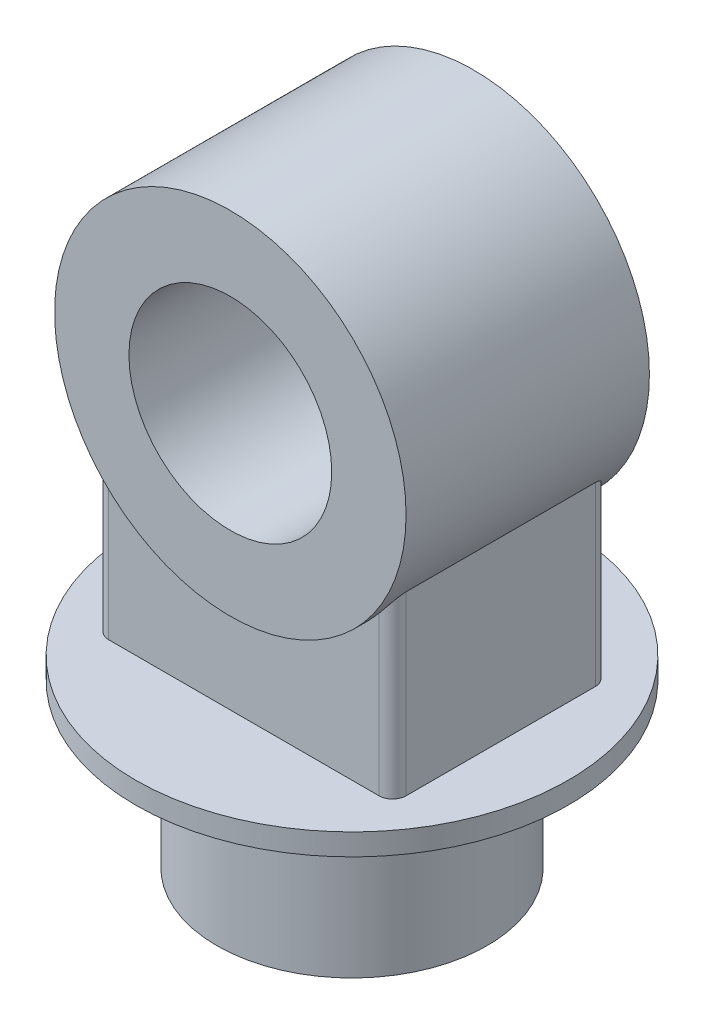
ISO-10303-21;
HEADER;
FILE_DESCRIPTION(('STEP AP214'),'2;1');
FILE_NAME('part.step','',(''),(''),'','','');
FILE_SCHEMA(('AUTOMOTIVE_DESIGN { 1 0 10303 214 1 1 1 1 }'));
ENDSEC;
DATA;
#1=APPLICATION_CONTEXT('core data for automotive mechanical design processes');
#2=APPLICATION_PROTOCOL_DEFINITION('international standard','automotive_design',2000,#1);
#3=PRODUCT_CONTEXT('',#1,'mechanical');
#4=PRODUCT('Part','Part','',(#3));
#5=PRODUCT_RELATED_PRODUCT_CATEGORY('part','',(#4));
#6=PRODUCT_DEFINITION_FORMATION('','',#4);
#7=PRODUCT_DEFINITION_CONTEXT('part definition',#1,'design');
#8=PRODUCT_DEFINITION('design','',#6,#7);
#9=PRODUCT_DEFINITION_SHAPE('','',#8);
#10=(LENGTH_UNIT() NAMED_UNIT(*) SI_UNIT(.MILLI.,.METRE.));
#11=(NAMED_UNIT(*) PLANE_ANGLE_UNIT() SI_UNIT($,.RADIAN.));
#12=(NAMED_UNIT(*) SI_UNIT($,.STERADIAN.) SOLID_ANGLE_UNIT());
#13=UNCERTAINTY_MEASURE_WITH_UNIT(LENGTH_MEASURE(1.E-05),#10,'distance_accuracy_value','');
#14=(GEOMETRIC_REPRESENTATION_CONTEXT(3) GLOBAL_UNCERTAINTY_ASSIGNED_CONTEXT((#13)) GLOBAL_UNIT_ASSIGNED_CONTEXT((#10,
#11,#12)) REPRESENTATION_CONTEXT('',''));
#15=CARTESIAN_POINT('',(0.,0.,0.));
#16=DIRECTION('',(0.,0.,1.));
#17=DIRECTION('',(1.,0.,0.));
#18=AXIS2_PLACEMENT_3D('',#15,#16,#17);
#19=CARTESIAN_POINT('',(0.,120.,0.));
#20=DIRECTION('',(0.,-1.,0.));
#21=DIRECTION('',(0.,0.,-1.));
#22=AXIS2_PLACEMENT_3D('',#19,#20,#21);
#23=CYLINDRICAL_SURFACE('',#22,100.);
#24=CARTESIAN_POINT('',(0.,120.,0.));
#25=DIRECTION('',(0.,1.,0.));
#26=DIRECTION('',(0.,0.,1.));
#27=AXIS2_PLACEMENT_3D('',#24,#25,#26);
#28=CIRCLE('',#27,100.);
#29=CARTESIAN_POINT('',(0.,120.,100.));
#30=VERTEX_POINT('',#29);
#31=EDGE_CURVE('E131',#30,#30,#28,.T.);
#32=ORIENTED_EDGE('',*,*,#31,.F.);
#33=EDGE_LOOP('',(#32));
#34=FACE_BOUND('',#33,.T.);
#35=CARTESIAN_POINT('',(0.,0.,0.));
#36=DIRECTION('',(0.,1.,0.));
#37=DIRECTION('',(0.,0.,1.));
#38=AXIS2_PLACEMENT_3D('',#35,#36,#37);
#39=CIRCLE('',#38,100.);
#40=CARTESIAN_POINT('',(0.,0.,100.));
#41=VERTEX_POINT('',#40);
#42=EDGE_CURVE('E203',#41,#41,#39,.T.);
#43=ORIENTED_EDGE('',*,*,#42,.T.);
#44=EDGE_LOOP('',(#43));
#45=FACE_BOUND('',#44,.T.);
#46=ADVANCED_FACE('F33',(#34,#45),#23,.T.);
#47=CARTESIAN_POINT('',(0.,0.,0.));
#48=DIRECTION('',(0.,1.,0.));
#49=DIRECTION('',(0.,0.,1.));
#50=AXIS2_PLACEMENT_3D('',#47,#48,#49);
#51=PLANE('',#50);
#52=ORIENTED_EDGE('',*,*,#42,.F.);
#53=EDGE_LOOP('',(#52));
#54=FACE_BOUND('',#53,.T.);
#55=ADVANCED_FACE('F213',(#54),#51,.F.);
#56=CARTESIAN_POINT('',(0.,136.,0.));
#57=DIRECTION('',(0.,-1.,0.));
#58=DIRECTION('',(0.,0.,-1.));
#59=AXIS2_PLACEMENT_3D('',#56,#57,#58);
#60=CYLINDRICAL_SURFACE('',#59,160.);
#61=CARTESIAN_POINT('',(0.,136.,0.));
#62=DIRECTION('',(0.,1.,0.));
#63=DIRECTION('',(0.,0.,1.));
#64=AXIS2_PLACEMENT_3D('',#61,#62,#63);
#65=CIRCLE('',#64,160.);
#66=CARTESIAN_POINT('',(0.,136.,160.));
#67=VERTEX_POINT('',#66);
#68=EDGE_CURVE('E200',#67,#67,#65,.T.);
#69=ORIENTED_EDGE('',*,*,#68,.F.);
#70=EDGE_LOOP('',(#69));
#71=FACE_BOUND('',#70,.T.);
#72=CARTESIAN_POINT('',(0.,120.,0.));
#73=DIRECTION('',(0.,1.,0.));
#74=DIRECTION('',(0.,0.,1.));
#75=AXIS2_PLACEMENT_3D('',#72,#73,#74);
#76=CIRCLE('',#75,160.);
#77=CARTESIAN_POINT('',(0.,120.,160.));
#78=VERTEX_POINT('',#77);
#79=EDGE_CURVE('E204',#78,#78,#76,.T.);
#80=ORIENTED_EDGE('',*,*,#79,.T.);
#81=EDGE_LOOP('',(#80));
#82=FACE_BOUND('',#81,.T.);
#83=ADVANCED_FACE('F215',(#71,#82),#60,.T.);
#84=CARTESIAN_POINT('',(0.,136.,0.));
#85=DIRECTION('',(0.,1.,0.));
#86=DIRECTION('',(0.,0.,1.));
#87=AXIS2_PLACEMENT_3D('',#84,#85,#86);
#88=PLANE('',#87);
#89=DIRECTION('',(0.,0.,1.));
#90=VECTOR('',#89,1.);
#91=CARTESIAN_POINT('',(-110.,136.,-80.));
#92=LINE('',#91,#90);
#93=CARTESIAN_POINT('',(-110.,136.,-70.));
#94=VERTEX_POINT('',#93);
#95=CARTESIAN_POINT('',(-110.,136.,70.));
#96=VERTEX_POINT('',#95);
#97=EDGE_CURVE('E188',#94,#96,#92,.T.);
#98=ORIENTED_EDGE('',*,*,#97,.F.);
#99=CARTESIAN_POINT('',(-100.,136.,-70.));
#100=DIRECTION('',(0.,1.,0.));
#101=DIRECTION('',(0.,0.,1.));
#102=AXIS2_PLACEMENT_3D('',#99,#100,#101);
#103=CIRCLE('',#102,10.);
#104=CARTESIAN_POINT('',(-100.,136.,-80.));
#105=VERTEX_POINT('',#104);
#106=EDGE_CURVE('E47',#94,#105,#103,.F.);
#107=ORIENTED_EDGE('',*,*,#106,.T.);
#108=DIRECTION('',(-1.,0.,0.));
#109=VECTOR('',#108,1.);
#110=CARTESIAN_POINT('',(110.,136.,-80.));
#111=LINE('',#110,#109);
#112=CARTESIAN_POINT('',(100.,136.,-80.));
#113=VERTEX_POINT('',#112);
#114=EDGE_CURVE('E187',#113,#105,#111,.T.);
#115=ORIENTED_EDGE('',*,*,#114,.F.);
#116=CARTESIAN_POINT('',(100.,136.,-70.));
#117=DIRECTION('',(0.,1.,0.));
#118=DIRECTION('',(0.,0.,1.));
#119=AXIS2_PLACEMENT_3D('',#116,#117,#118);
#120=CIRCLE('',#119,10.);
#121=CARTESIAN_POINT('',(110.,136.,-70.));
#122=VERTEX_POINT('',#121);
#123=EDGE_CURVE('E174',#113,#122,#120,.F.);
#124=ORIENTED_EDGE('',*,*,#123,.T.);
#125=DIRECTION('',(0.,0.,-1.));
#126=VECTOR('',#125,1.);
#127=CARTESIAN_POINT('',(110.,136.,-80.));
#128=LINE('',#127,#126);
#129=CARTESIAN_POINT('',(110.,136.,70.));
#130=VERTEX_POINT('',#129);
#131=EDGE_CURVE('E193',#130,#122,#128,.T.);
#132=ORIENTED_EDGE('',*,*,#131,.F.);
#133=CARTESIAN_POINT('',(100.,136.,70.));
#134=DIRECTION('',(0.,1.,0.));
#135=DIRECTION('',(0.,0.,1.));
#136=AXIS2_PLACEMENT_3D('',#133,#134,#135);
#137=CIRCLE('',#136,10.);
#138=CARTESIAN_POINT('',(100.,136.,80.));
#139=VERTEX_POINT('',#138);
#140=EDGE_CURVE('E112',#130,#139,#137,.F.);
#141=ORIENTED_EDGE('',*,*,#140,.T.);
#142=DIRECTION('',(1.,0.,0.));
#143=VECTOR('',#142,1.);
#144=CARTESIAN_POINT('',(110.,136.,80.));
#145=LINE('',#144,#143);
#146=CARTESIAN_POINT('',(-100.,136.,80.));
#147=VERTEX_POINT('',#146);
#148=EDGE_CURVE('E266',#147,#139,#145,.T.);
#149=ORIENTED_EDGE('',*,*,#148,.F.);
#150=CARTESIAN_POINT('',(-100.,136.,70.));
#151=DIRECTION('',(0.,1.,0.));
#152=DIRECTION('',(0.,0.,1.));
#153=AXIS2_PLACEMENT_3D('',#150,#151,#152);
#154=CIRCLE('',#153,10.);
#155=EDGE_CURVE('E113',#147,#96,#154,.F.);
#156=ORIENTED_EDGE('',*,*,#155,.T.);
#157=EDGE_LOOP('',(#98,#107,#115,#124,#132,#141,#149,#156));
#158=FACE_BOUND('',#157,.T.);
#159=ORIENTED_EDGE('',*,*,#68,.T.);
#160=EDGE_LOOP('',(#159));
#161=FACE_BOUND('',#160,.T.);
#162=ADVANCED_FACE('F185',(#158,#161),#88,.T.);
#163=CARTESIAN_POINT('',(0.,120.,0.));
#164=DIRECTION('',(0.,1.,0.));
#165=DIRECTION('',(0.,0.,1.));
#166=AXIS2_PLACEMENT_3D('',#163,#164,#165);
#167=PLANE('',#166);
#168=ORIENTED_EDGE('',*,*,#31,.T.);
#169=EDGE_LOOP('',(#168));
#170=FACE_BOUND('',#169,.T.);
#171=ORIENTED_EDGE('',*,*,#79,.F.);
#172=EDGE_LOOP('',(#171));
#173=FACE_BOUND('',#172,.T.);
#174=ADVANCED_FACE('F224',(#170,#173),#167,.F.);
#175=CARTESIAN_POINT('',(110.,466.002,80.));
#176=DIRECTION('',(0.,0.,-1.));
#177=DIRECTION('',(-1.,0.,0.));
#178=AXIS2_PLACEMENT_3D('',#175,#176,#177);
#179=PLANE('',#178);
#180=CARTESIAN_POINT('',(0.,336.,80.));
#181=DIRECTION('',(0.,0.,-1.));
#182=DIRECTION('',(-1.,0.,0.));
#183=AXIS2_PLACEMENT_3D('',#180,#181,#182);
#184=CIRCLE('',#183,130.);
#185=CARTESIAN_POINT('',(-100.,252.933761370819,80.));
#186=VERTEX_POINT('',#185);
#187=CARTESIAN_POINT('',(100.,252.933761370819,80.));
#188=VERTEX_POINT('',#187);
#189=EDGE_CURVE('E105',#186,#188,#184,.F.);
#190=ORIENTED_EDGE('',*,*,#189,.F.);
#191=DIRECTION('',(0.,-1.,0.));
#192=VECTOR('',#191,1.);
#193=CARTESIAN_POINT('',(-100.,466.002,80.));
#194=LINE('',#193,#192);
#195=EDGE_CURVE('E119',#186,#147,#194,.T.);
#196=ORIENTED_EDGE('',*,*,#195,.T.);
#197=ORIENTED_EDGE('',*,*,#148,.T.);
#198=DIRECTION('',(0.,-1.,0.));
#199=VECTOR('',#198,1.);
#200=CARTESIAN_POINT('',(100.,466.002,80.));
#201=LINE('',#200,#199);
#202=EDGE_CURVE('E122',#139,#188,#201,.F.);
#203=ORIENTED_EDGE('',*,*,#202,.T.);
#204=EDGE_LOOP('',(#190,#196,#197,#203));
#205=FACE_BOUND('',#204,.T.);
#206=ADVANCED_FACE('F117',(#205),#179,.F.);
#207=CARTESIAN_POINT('',(-110.,466.002,-80.));
#208=DIRECTION('',(1.,0.,0.));
#209=DIRECTION('',(0.,0.,-1.));
#210=AXIS2_PLACEMENT_3D('',#207,#208,#209);
#211=PLANE('',#210);
#212=DIRECTION('',(0.,0.,-1.));
#213=VECTOR('',#212,1.);
#214=CARTESIAN_POINT('',(-110.,266.717967697245,90.));
#215=LINE('',#214,#213);
#216=CARTESIAN_POINT('',(-110.,266.717967697245,-70.));
#217=VERTEX_POINT('',#216);
#218=CARTESIAN_POINT('',(-110.,266.717967697245,70.));
#219=VERTEX_POINT('',#218);
#220=EDGE_CURVE('E107',#217,#219,#215,.F.);
#221=ORIENTED_EDGE('',*,*,#220,.F.);
#222=DIRECTION('',(0.,-1.,0.));
#223=VECTOR('',#222,1.);
#224=CARTESIAN_POINT('',(-110.,466.002,-70.));
#225=LINE('',#224,#223);
#226=EDGE_CURVE('E172',#217,#94,#225,.T.);
#227=ORIENTED_EDGE('',*,*,#226,.T.);
#228=ORIENTED_EDGE('',*,*,#97,.T.);
#229=DIRECTION('',(0.,-1.,0.));
#230=VECTOR('',#229,1.);
#231=CARTESIAN_POINT('',(-110.,466.002,70.));
#232=LINE('',#231,#230);
#233=EDGE_CURVE('E127',#96,#219,#232,.F.);
#234=ORIENTED_EDGE('',*,*,#233,.T.);
#235=EDGE_LOOP('',(#221,#227,#228,#234));
#236=FACE_BOUND('',#235,.T.);
#237=ADVANCED_FACE('F196',(#236),#211,.F.);
#238=CARTESIAN_POINT('',(110.,466.002,-80.));
#239=DIRECTION('',(-1.,0.,0.));
#240=DIRECTION('',(0.,0.,1.));
#241=AXIS2_PLACEMENT_3D('',#238,#239,#240);
#242=PLANE('',#241);
#243=ORIENTED_EDGE('',*,*,#131,.T.);
#244=DIRECTION('',(0.,-1.,0.));
#245=VECTOR('',#244,1.);
#246=CARTESIAN_POINT('',(110.,466.002,-70.));
#247=LINE('',#246,#245);
#248=CARTESIAN_POINT('',(110.,266.717967697245,-70.));
#249=VERTEX_POINT('',#248);
#250=EDGE_CURVE('E170',#122,#249,#247,.F.);
#251=ORIENTED_EDGE('',*,*,#250,.T.);
#252=DIRECTION('',(0.,0.,-1.));
#253=VECTOR('',#252,1.);
#254=CARTESIAN_POINT('',(110.,266.717967697245,90.));
#255=LINE('',#254,#253);
#256=CARTESIAN_POINT('',(110.,266.717967697245,70.));
#257=VERTEX_POINT('',#256);
#258=EDGE_CURVE('E123',#257,#249,#255,.T.);
#259=ORIENTED_EDGE('',*,*,#258,.F.);
#260=DIRECTION('',(0.,-1.,0.));
#261=VECTOR('',#260,1.);
#262=CARTESIAN_POINT('',(110.,466.002,70.));
#263=LINE('',#262,#261);
#264=EDGE_CURVE('E129',#257,#130,#263,.T.);
#265=ORIENTED_EDGE('',*,*,#264,.T.);
#266=EDGE_LOOP('',(#243,#251,#259,#265));
#267=FACE_BOUND('',#266,.T.);
#268=ADVANCED_FACE('F232',(#267),#242,.F.);
#269=CARTESIAN_POINT('',(110.,466.002,-80.));
#270=DIRECTION('',(0.,0.,1.));
#271=DIRECTION('',(1.,0.,0.));
#272=AXIS2_PLACEMENT_3D('',#269,#270,#271);
#273=PLANE('',#272);
#274=CARTESIAN_POINT('',(0.,336.,-80.));
#275=DIRECTION('',(0.,0.,1.));
#276=DIRECTION('',(1.,0.,0.));
#277=AXIS2_PLACEMENT_3D('',#274,#275,#276);
#278=CIRCLE('',#277,130.);
#279=CARTESIAN_POINT('',(100.,252.933761370819,-80.0000000000001));
#280=VERTEX_POINT('',#279);
#281=CARTESIAN_POINT('',(-100.,252.933761370819,-80.));
#282=VERTEX_POINT('',#281);
#283=EDGE_CURVE('E207',#280,#282,#278,.F.);
#284=ORIENTED_EDGE('',*,*,#283,.F.);
#285=DIRECTION('',(0.,-1.,0.));
#286=VECTOR('',#285,1.);
#287=CARTESIAN_POINT('',(100.,466.002,-80.));
#288=LINE('',#287,#286);
#289=EDGE_CURVE('E167',#280,#113,#288,.T.);
#290=ORIENTED_EDGE('',*,*,#289,.T.);
#291=ORIENTED_EDGE('',*,*,#114,.T.);
#292=DIRECTION('',(0.,-1.,0.));
#293=VECTOR('',#292,1.);
#294=CARTESIAN_POINT('',(-100.,466.002,-80.));
#295=LINE('',#294,#293);
#296=EDGE_CURVE('E165',#105,#282,#295,.F.);
#297=ORIENTED_EDGE('',*,*,#296,.T.);
#298=EDGE_LOOP('',(#284,#290,#291,#297));
#299=FACE_BOUND('',#298,.T.);
#300=ADVANCED_FACE('F191',(#299),#273,.F.);
#301=CARTESIAN_POINT('',(0.,336.,90.));
#302=DIRECTION('',(0.,0.,-1.));
#303=DIRECTION('',(-1.,0.,0.));
#304=AXIS2_PLACEMENT_3D('',#301,#302,#303);
#305=CYLINDRICAL_SURFACE('',#304,130.);
#306=CARTESIAN_POINT('',(0.,336.,90.));
#307=DIRECTION('',(0.,0.,1.));
#308=DIRECTION('',(1.,0.,0.));
#309=AXIS2_PLACEMENT_3D('',#306,#307,#308);
#310=CIRCLE('',#309,130.);
#311=CARTESIAN_POINT('',(130.,336.,90.));
#312=VERTEX_POINT('',#311);
#313=EDGE_CURVE('E252',#312,#312,#310,.T.);
#314=ORIENTED_EDGE('',*,*,#313,.F.);
#315=EDGE_LOOP('',(#314));
#316=FACE_BOUND('',#315,.T.);
#317=CARTESIAN_POINT('',(0.,336.,-90.));
#318=DIRECTION('',(0.,0.,1.));
#319=DIRECTION('',(1.,0.,0.));
#320=AXIS2_PLACEMENT_3D('',#317,#318,#319);
#321=CIRCLE('',#320,130.);
#322=CARTESIAN_POINT('',(130.,336.,-90.));
#323=VERTEX_POINT('',#322);
#324=EDGE_CURVE('E255',#323,#323,#321,.T.);
#325=ORIENTED_EDGE('',*,*,#324,.T.);
#326=EDGE_LOOP('',(#325));
#327=FACE_BOUND('',#326,.T.);
#328=ORIENTED_EDGE('',*,*,#283,.T.);
#329=CARTESIAN_POINT('',(-100.,252.933761370819,-80.));
#330=CARTESIAN_POINT('',(-100.223611151915,253.202952503255,-79.9999830665315));
#331=CARTESIAN_POINT('',(-100.446118360057,253.473036166024,-79.9924995885085));
#332=CARTESIAN_POINT('',(-100.888548742496,254.014496760122,-79.9629173131463));
#333=CARTESIAN_POINT('',(-101.108472043759,254.285873626978,-79.9408192370116));
#334=CARTESIAN_POINT('',(-101.545586290072,254.829711400373,-79.8822979337703));
#335=CARTESIAN_POINT('',(-101.76277446753,255.102173087004,-79.8458612385231));
#336=CARTESIAN_POINT('',(-102.193849033468,255.647413797012,-79.7588609087488));
#337=CARTESIAN_POINT('',(-102.407735374993,255.920192824843,-79.7082970735217));
#338=CARTESIAN_POINT('',(-103.048408055095,256.74400885936,-79.5343891784366));
#339=CARTESIAN_POINT('',(-103.469748368072,257.294974230618,-79.3894263280958));
#340=CARTESIAN_POINT('',(-104.088382224678,258.117224843771,-79.1288060997197));
#341=CARTESIAN_POINT('',(-104.292337034927,258.39057162742,-79.0347525474724));
#342=CARTESIAN_POINT('',(-104.695498702643,258.935304765081,-78.8319429710982));
#343=CARTESIAN_POINT('',(-104.894706004332,259.206691300842,-78.7231883289499));
#344=CARTESIAN_POINT('',(-105.336170271764,259.812965668139,-78.4620472638272));
#345=CARTESIAN_POINT('',(-105.577006541077,260.147108038148,-78.3055009036513));
#346=CARTESIAN_POINT('',(-106.04966094987,260.809343252621,-77.967808626391));
#347=CARTESIAN_POINT('',(-106.281479043935,261.137436066616,-77.7866625854444));
#348=CARTESIAN_POINT('',(-106.734152264033,261.784259610706,-77.3986376161628));
#349=CARTESIAN_POINT('',(-106.955036134368,262.103013877599,-77.1918317878758));
#350=CARTESIAN_POINT('',(-107.384708325122,262.728803605627,-76.749894392022));
#351=CARTESIAN_POINT('',(-107.593501627276,263.035843875289,-76.5147746155492));
#352=CARTESIAN_POINT('',(-107.921279015409,263.522080966666,-76.1068757916446));
#353=CARTESIAN_POINT('',(-108.044709884718,263.706240813682,-75.9435605188263));
#354=CARTESIAN_POINT('',(-108.284949666933,264.066582834907,-75.6038296157538));
#355=CARTESIAN_POINT('',(-108.401760304956,264.242767084986,-75.4274174262629));
#356=CARTESIAN_POINT('',(-108.627683741988,264.585236991633,-75.0605773993747));
#357=CARTESIAN_POINT('',(-108.736797961361,264.751524473746,-74.8701521613913));
#358=CARTESIAN_POINT('',(-108.945874410432,265.071634412635,-74.4745306992528));
#359=CARTESIAN_POINT('',(-109.04583974995,265.225461102935,-74.2693395369045));
#360=CARTESIAN_POINT('',(-109.274660386151,265.579056080623,-73.7536743100228));
#361=CARTESIAN_POINT('',(-109.398046362816,265.771031349643,-73.4351396850743));
#362=CARTESIAN_POINT('',(-109.561336457207,266.026263049992,-72.9345418523036));
#363=CARTESIAN_POINT('',(-109.612072269395,266.105785634321,-72.7641622498837));
#364=CARTESIAN_POINT('',(-109.705421847597,266.25239837099,-72.4160328323223));
#365=CARTESIAN_POINT('',(-109.748040656091,266.319496241142,-72.2382876769633));
#366=CARTESIAN_POINT('',(-109.820262744001,266.433384610412,-71.8947331689277));
#367=CARTESIAN_POINT('',(-109.850752312767,266.481551609067,-71.7295676109391));
#368=CARTESIAN_POINT('',(-109.903691363628,266.565274678988,-71.3948451418077));
#369=CARTESIAN_POINT('',(-109.926143541964,266.600834979285,-71.2252897238034));
#370=CARTESIAN_POINT('',(-109.962659042777,266.658707696818,-70.8807814271978));
#371=CARTESIAN_POINT('',(-109.976613864032,266.680848750137,-70.7057875562757));
#372=CARTESIAN_POINT('',(-109.99061964662,266.703076138542,-70.4419386674803));
#373=CARTESIAN_POINT('',(-109.99413386492,266.708654625171,-70.3536902139711));
#374=CARTESIAN_POINT('',(-109.998824989492,266.716102079046,-70.1769662160102));
#375=CARTESIAN_POINT('',(-110.000001659485,266.717970671296,-70.088490649507));
#376=CARTESIAN_POINT('',(-110.,266.717967697245,-70.));
#377=B_SPLINE_CURVE_WITH_KNOTS('',3,(#329,#330,#331,#332,#333,#334,#335,#336,#337,#338,#339,
#340,#341,#342,#343,#344,#345,#346,#347,#348,#349,#350,#351,#352,#353,#354,#355,#356,#357,#358,
#359,#360,#361,#362,#363,#364,#365,#366,#367,#368,#369,#370,#371,#372,#373,#374,#375,#376),
.UNSPECIFIED.,.F.,.F.,(4,2,2,2,2,2,2,2,2,2,2,2,2,2,2,2,2,2,2,2,2,2,2,4),(0.,1.04974156507777,
2.09943133114568,3.1501094241726,4.20080244462026,6.32356278933854,7.38465211465329,
8.44564176134495,9.7667768553939,11.0879186017609,12.4053795382948,13.7222937149076,
14.5479419827463,15.3733741023697,16.1986534888326,17.0236513022889,18.1946866504919,
18.7783719827905,19.3616935243414,19.8852298594992,20.408590403038,20.9385006934629,
21.2038887699912,21.4693036704869),.UNSPECIFIED.);
#378=EDGE_CURVE('E11',#282,#217,#377,.T.);
#379=ORIENTED_EDGE('',*,*,#378,.T.);
#380=ORIENTED_EDGE('',*,*,#220,.T.);
#381=CARTESIAN_POINT('',(-110.,266.717967697245,70.));
#382=CARTESIAN_POINT('',(-110.000033683462,266.718025852698,70.1614230595313));
#383=CARTESIAN_POINT('',(-109.996092792414,266.711764254296,70.3228118197691));
#384=CARTESIAN_POINT('',(-109.980519982779,266.687045880384,70.6441123999957));
#385=CARTESIAN_POINT('',(-109.968896213713,266.668602027069,70.8040256031146));
#386=CARTESIAN_POINT('',(-109.938376398954,266.620217986395,71.1196424551221));
#387=CARTESIAN_POINT('',(-109.919558261622,266.590400967593,71.2753727040436));
#388=CARTESIAN_POINT('',(-109.875071558334,266.52000006118,71.5834085562726));
#389=CARTESIAN_POINT('',(-109.849400846184,266.479412800404,71.7357130704249));
#390=CARTESIAN_POINT('',(-109.784772267017,266.377386983169,72.0722520040974));
#391=CARTESIAN_POINT('',(-109.744103525393,266.313281105856,72.2553511890568));
#392=CARTESIAN_POINT('',(-109.654040532803,266.17165023193,72.6141464391851));
#393=CARTESIAN_POINT('',(-109.604640075501,266.094115691273,72.7898371277865));
#394=CARTESIAN_POINT('',(-109.497968805892,265.927147418338,73.133872391345));
#395=CARTESIAN_POINT('',(-109.440667457039,265.837667562915,73.302184951541));
#396=CARTESIAN_POINT('',(-109.319341126161,265.648779195145,73.6304969218558));
#397=CARTESIAN_POINT('',(-109.25531768694,265.549372961282,73.7904982269664));
#398=CARTESIAN_POINT('',(-109.085069343255,265.28590129292,74.1868876463209));
#399=CARTESIAN_POINT('',(-108.974781990569,265.115997241409,74.4176642111939));
#400=CARTESIAN_POINT('',(-108.742772943656,264.76058359918,74.8607110351426));
#401=CARTESIAN_POINT('',(-108.621044869784,264.575065307649,75.072970840064));
#402=CARTESIAN_POINT('',(-108.36794946479,264.19164129378,75.4804206329535));
#403=CARTESIAN_POINT('',(-108.236568322626,263.993717884812,75.6755852518652));
#404=CARTESIAN_POINT('',(-107.965814499919,263.588382733387,76.0497203250662));
#405=CARTESIAN_POINT('',(-107.826442440892,263.380971729107,76.2286920360201));
#406=CARTESIAN_POINT('',(-107.56145650763,262.989174407744,76.5468161797372));
#407=CARTESIAN_POINT('',(-107.436764821801,262.805791987749,76.6879854690674));
#408=CARTESIAN_POINT('',(-107.182869679799,262.434497987953,76.9599552926783));
#409=CARTESIAN_POINT('',(-107.053665586411,262.24658576965,77.0907543539386));
#410=CARTESIAN_POINT('',(-106.659844344167,261.677121003612,77.4685356621902));
#411=CARTESIAN_POINT('',(-106.389102445143,261.289965080353,77.7008024816961));
#412=CARTESIAN_POINT('',(-105.833418194947,260.504836154638,78.129863631631));
#413=CARTESIAN_POINT('',(-105.548442441802,260.106838810795,78.3265689888296));
#414=CARTESIAN_POINT('',(-104.96676628824,259.304344779382,78.6860846955171));
#415=CARTESIAN_POINT('',(-104.670068038633,258.899849292081,78.8489012287858));
#416=CARTESIAN_POINT('',(-104.024574509401,258.030646711215,79.1623550419402));
#417=CARTESIAN_POINT('',(-103.674248758637,257.565348460988,79.3081944572228));
#418=CARTESIAN_POINT('',(-102.961876677953,256.632523338709,79.558756520093));
#419=CARTESIAN_POINT('',(-102.599828734006,256.16499616738,79.6634734792563));
#420=CARTESIAN_POINT('',(-102.051092736822,255.466397204689,79.7891645729387));
#421=CARTESIAN_POINT('',(-101.868137468165,255.235094848973,79.8257282191264));
#422=CARTESIAN_POINT('',(-101.499966150616,254.77288550036,79.8886289353229));
#423=CARTESIAN_POINT('',(-101.314750133026,254.541978502041,79.9149661467555));
#424=CARTESIAN_POINT('',(-100.942320486513,254.080919722901,79.9572665465168));
#425=CARTESIAN_POINT('',(-100.755107350153,253.850767773367,79.9732322353467));
#426=CARTESIAN_POINT('',(-100.378860262163,253.391449185777,79.9945948234744));
#427=CARTESIAN_POINT('',(-100.189826234412,253.162282589497,79.9999912789888));
#428=CARTESIAN_POINT('',(-100.,252.933761370819,80.));
#429=B_SPLINE_CURVE_WITH_KNOTS('',3,(#381,#382,#383,#384,#385,#386,#387,#388,#389,#390,#391,
#392,#393,#394,#395,#396,#397,#398,#399,#400,#401,#402,#403,#404,#405,#406,#407,#408,#409,#410,
#411,#412,#413,#414,#415,#416,#417,#418,#419,#420,#421,#422,#423,#424,#425,#426,#427,#428),
.UNSPECIFIED.,.F.,.F.,(4,2,2,2,2,2,2,2,2,2,2,2,2,2,2,2,2,2,2,2,2,2,2,4),(0.,0.48404500592307,
0.967577389145413,1.44601544684507,1.92460352520314,2.51835043890467,3.11252108624072,
3.7090561398874,4.30545457926273,5.22516595363376,6.14539326092329,7.06696382284195,
7.98846280401965,8.77680092000537,9.56525081419898,11.1426900482286,12.7240229357798,
14.305067020047,16.1047501551828,17.9046821508917,18.7960435003637,19.6873925225409,
20.5785265668948,21.4696980275819),.UNSPECIFIED.);
#430=EDGE_CURVE('E102',#219,#186,#429,.T.);
#431=ORIENTED_EDGE('',*,*,#430,.T.);
#432=ORIENTED_EDGE('',*,*,#189,.T.);
#433=CARTESIAN_POINT('',(100.,252.933761370819,80.));
#434=CARTESIAN_POINT('',(100.223611151915,253.202952503255,79.9999830665315));
#435=CARTESIAN_POINT('',(100.446118360057,253.473036166024,79.9924995885084));
#436=CARTESIAN_POINT('',(100.888548742496,254.014496760122,79.9629173131463));
#437=CARTESIAN_POINT('',(101.10847204376,254.285873626978,79.9408192370115));
#438=CARTESIAN_POINT('',(101.545586290072,254.829711400373,79.8822979337703));
#439=CARTESIAN_POINT('',(101.76277446753,255.102173087004,79.8458612385231));
#440=CARTESIAN_POINT('',(102.193849033468,255.647413797012,79.7588609087488));
#441=CARTESIAN_POINT('',(102.407735374993,255.920192824843,79.7082970735217));
#442=CARTESIAN_POINT('',(103.048408055095,256.74400885936,79.5343891784366));
#443=CARTESIAN_POINT('',(103.469748368072,257.294974230618,79.3894263280957));
#444=CARTESIAN_POINT('',(104.088382224678,258.117224843771,79.1288060997197));
#445=CARTESIAN_POINT('',(104.292337034927,258.39057162742,79.0347525474724));
#446=CARTESIAN_POINT('',(104.695498702643,258.935304765081,78.8319429710981));
#447=CARTESIAN_POINT('',(104.894706004332,259.206691300842,78.7231883289499));
#448=CARTESIAN_POINT('',(105.336170271764,259.812965668139,78.4620472638272));
#449=CARTESIAN_POINT('',(105.577006541077,260.147108038148,78.3055009036513));
#450=CARTESIAN_POINT('',(106.04966094987,260.809343252621,77.967808626391));
#451=CARTESIAN_POINT('',(106.281479043935,261.137436066616,77.7866625854444));
#452=CARTESIAN_POINT('',(106.734152264033,261.784259610706,77.3986376161629));
#453=CARTESIAN_POINT('',(106.955036134368,262.103013877598,77.1918317878758));
#454=CARTESIAN_POINT('',(107.384708325122,262.728803605627,76.7498943920221));
#455=CARTESIAN_POINT('',(107.593501627276,263.035843875289,76.5147746155493));
#456=CARTESIAN_POINT('',(107.921279015409,263.522080966666,76.1068757916446));
#457=CARTESIAN_POINT('',(108.044709884718,263.706240813682,75.9435605188263));
#458=CARTESIAN_POINT('',(108.284949666933,264.066582834907,75.6038296157538));
#459=CARTESIAN_POINT('',(108.401760304956,264.242767084986,75.4274174262629));
#460=CARTESIAN_POINT('',(108.627683741988,264.585236991633,75.0605773993747));
#461=CARTESIAN_POINT('',(108.736797961361,264.751524473746,74.8701521613913));
#462=CARTESIAN_POINT('',(108.945874410432,265.071634412635,74.4745306992528));
#463=CARTESIAN_POINT('',(109.04583974995,265.225461102935,74.2693395369045));
#464=CARTESIAN_POINT('',(109.274660386151,265.579056080623,73.7536743100227));
#465=CARTESIAN_POINT('',(109.398046362816,265.771031349643,73.4351396850742));
#466=CARTESIAN_POINT('',(109.561336457207,266.026263049992,72.9345418523036));
#467=CARTESIAN_POINT('',(109.612072269395,266.105785634321,72.7641622498837));
#468=CARTESIAN_POINT('',(109.705421847597,266.25239837099,72.4160328323223));
#469=CARTESIAN_POINT('',(109.748040656091,266.319496241142,72.2382876769633));
#470=CARTESIAN_POINT('',(109.820262744001,266.433384610412,71.8947331689276));
#471=CARTESIAN_POINT('',(109.850752312767,266.481551609067,71.729567610939));
#472=CARTESIAN_POINT('',(109.903691363628,266.565274678987,71.3948451418076));
#473=CARTESIAN_POINT('',(109.926143541964,266.600834979285,71.2252897238033));
#474=CARTESIAN_POINT('',(109.962659042777,266.658707696818,70.8807814271977));
#475=CARTESIAN_POINT('',(109.976613864032,266.680848750137,70.7057875562757));
#476=CARTESIAN_POINT('',(109.99061964662,266.703076138542,70.4419386674803));
#477=CARTESIAN_POINT('',(109.99413386492,266.708654625171,70.3536902139711));
#478=CARTESIAN_POINT('',(109.998824989492,266.716102079046,70.1769662160102));
#479=CARTESIAN_POINT('',(110.000001659485,266.717970671296,70.088490649507));
#480=CARTESIAN_POINT('',(110.,266.717967697245,70.));
#481=B_SPLINE_CURVE_WITH_KNOTS('',3,(#433,#434,#435,#436,#437,#438,#439,#440,#441,#442,#443,
#444,#445,#446,#447,#448,#449,#450,#451,#452,#453,#454,#455,#456,#457,#458,#459,#460,#461,#462,
#463,#464,#465,#466,#467,#468,#469,#470,#471,#472,#473,#474,#475,#476,#477,#478,#479,#480),
.UNSPECIFIED.,.F.,.F.,(4,2,2,2,2,2,2,2,2,2,2,2,2,2,2,2,2,2,2,2,2,2,2,4),(0.,1.04974156507779,
2.09943133114571,3.15010942417265,4.20080244462031,6.32356278933855,7.38465211465329,
8.44564176134495,9.7667768553939,11.0879186017609,12.4053795382948,13.7222937149076,
14.5479419827463,15.3733741023697,16.1986534888325,17.0236513022889,18.1946866504919,
18.7783719827904,19.3616935243415,19.8852298594992,20.408590403038,20.9385006934629,
21.2038887699912,21.4693036704869),.UNSPECIFIED.);
#482=EDGE_CURVE('E159',#188,#257,#481,.T.);
#483=ORIENTED_EDGE('',*,*,#482,.T.);
#484=ORIENTED_EDGE('',*,*,#258,.T.);
#485=CARTESIAN_POINT('',(110.,266.717967697245,-70.));
#486=CARTESIAN_POINT('',(110.000033683462,266.718025852698,-70.1614230595313));
#487=CARTESIAN_POINT('',(109.996092792414,266.711764254296,-70.3228118197691));
#488=CARTESIAN_POINT('',(109.980519982779,266.687045880384,-70.6441123999958));
#489=CARTESIAN_POINT('',(109.968896213713,266.668602027069,-70.8040256031146));
#490=CARTESIAN_POINT('',(109.938376398954,266.620217986395,-71.1196424551221));
#491=CARTESIAN_POINT('',(109.919558261622,266.590400967593,-71.2753727040436));
#492=CARTESIAN_POINT('',(109.875071558334,266.52000006118,-71.5834085562726));
#493=CARTESIAN_POINT('',(109.849400846184,266.479412800404,-71.735713070425));
#494=CARTESIAN_POINT('',(109.784772267017,266.377386983169,-72.0722520040975));
#495=CARTESIAN_POINT('',(109.744103525393,266.313281105856,-72.2553511890568));
#496=CARTESIAN_POINT('',(109.654040532803,266.17165023193,-72.6141464391851));
#497=CARTESIAN_POINT('',(109.604640075501,266.094115691273,-72.7898371277865));
#498=CARTESIAN_POINT('',(109.497968805892,265.927147418338,-73.1338723913451));
#499=CARTESIAN_POINT('',(109.440667457039,265.837667562915,-73.3021849515411));
#500=CARTESIAN_POINT('',(109.319341126161,265.648779195145,-73.6304969218558));
#501=CARTESIAN_POINT('',(109.25531768694,265.549372961282,-73.7904982269664));
#502=CARTESIAN_POINT('',(109.085069343255,265.28590129292,-74.1868876463209));
#503=CARTESIAN_POINT('',(108.974781990569,265.115997241409,-74.4176642111939));
#504=CARTESIAN_POINT('',(108.742772943656,264.76058359918,-74.8607110351427));
#505=CARTESIAN_POINT('',(108.621044869784,264.575065307649,-75.0729708400641));
#506=CARTESIAN_POINT('',(108.36794946479,264.19164129378,-75.4804206329535));
#507=CARTESIAN_POINT('',(108.236568322626,263.993717884812,-75.6755852518652));
#508=CARTESIAN_POINT('',(107.965814499919,263.588382733387,-76.0497203250662));
#509=CARTESIAN_POINT('',(107.826442440892,263.380971729107,-76.2286920360201));
#510=CARTESIAN_POINT('',(107.56145650763,262.989174407744,-76.5468161797372));
#511=CARTESIAN_POINT('',(107.436764821801,262.805791987749,-76.6879854690674));
#512=CARTESIAN_POINT('',(107.182869679799,262.434497987953,-76.9599552926783));
#513=CARTESIAN_POINT('',(107.053665586411,262.24658576965,-77.0907543539386));
#514=CARTESIAN_POINT('',(106.659844344167,261.677121003612,-77.4685356621902));
#515=CARTESIAN_POINT('',(106.389102445143,261.289965080353,-77.7008024816961));
#516=CARTESIAN_POINT('',(105.833418194946,260.504836154638,-78.129863631631));
#517=CARTESIAN_POINT('',(105.548442441802,260.106838810795,-78.3265689888296));
#518=CARTESIAN_POINT('',(104.96676628824,259.304344779382,-78.6860846955172));
#519=CARTESIAN_POINT('',(104.670068038633,258.899849292081,-78.8489012287858));
#520=CARTESIAN_POINT('',(104.024574509401,258.030646711215,-79.1623550419402));
#521=CARTESIAN_POINT('',(103.674248758637,257.565348460988,-79.3081944572229));
#522=CARTESIAN_POINT('',(102.961876677953,256.632523338709,-79.558756520093));
#523=CARTESIAN_POINT('',(102.599828734006,256.16499616738,-79.6634734792563));
#524=CARTESIAN_POINT('',(102.051092736822,255.466397204689,-79.7891645729388));
#525=CARTESIAN_POINT('',(101.868137468165,255.235094848973,-79.8257282191265));
#526=CARTESIAN_POINT('',(101.499966150616,254.77288550036,-79.8886289353229));
#527=CARTESIAN_POINT('',(101.314750133026,254.541978502041,-79.9149661467555));
#528=CARTESIAN_POINT('',(100.942320486513,254.080919722901,-79.9572665465168));
#529=CARTESIAN_POINT('',(100.755107350153,253.850767773367,-79.9732322353467));
#530=CARTESIAN_POINT('',(100.378860262163,253.391449185777,-79.9945948234744));
#531=CARTESIAN_POINT('',(100.189826234412,253.162282589497,-79.9999912789888));
#532=CARTESIAN_POINT('',(100.,252.933761370819,-80.));
#533=B_SPLINE_CURVE_WITH_KNOTS('',3,(#485,#486,#487,#488,#489,#490,#491,#492,#493,#494,#495,
#496,#497,#498,#499,#500,#501,#502,#503,#504,#505,#506,#507,#508,#509,#510,#511,#512,#513,#514,
#515,#516,#517,#518,#519,#520,#521,#522,#523,#524,#525,#526,#527,#528,#529,#530,#531,#532),
.UNSPECIFIED.,.F.,.F.,(4,2,2,2,2,2,2,2,2,2,2,2,2,2,2,2,2,2,2,2,2,2,2,4),(0.,0.484045005923074,
0.967577389145425,1.44601544684506,1.92460352520314,2.51835043890468,3.11252108624077,
3.70905613988741,4.30545457926274,5.22516595363374,6.1453932609233,7.06696382284192,
7.98846280401964,8.77680092000536,9.56525081419895,11.1426900482287,12.7240229357798,
14.305067020047,16.1047501551828,17.9046821508917,18.7960435003637,19.6873925225409,
20.5785265668947,21.4696980275819),.UNSPECIFIED.);
#534=EDGE_CURVE('E176',#249,#280,#533,.T.);
#535=ORIENTED_EDGE('',*,*,#534,.T.);
#536=EDGE_LOOP('',(#328,#379,#380,#431,#432,#483,#484,#535));
#537=FACE_BOUND('',#536,.T.);
#538=ADVANCED_FACE('F104',(#316,#327,#537),#305,.T.);
#539=CARTESIAN_POINT('',(0.,336.,90.));
#540=DIRECTION('',(0.,0.,1.));
#541=DIRECTION('',(1.,0.,0.));
#542=AXIS2_PLACEMENT_3D('',#539,#540,#541);
#543=PLANE('',#542);
#544=ORIENTED_EDGE('',*,*,#313,.T.);
#545=EDGE_LOOP('',(#544));
#546=FACE_BOUND('',#545,.T.);
#547=CARTESIAN_POINT('',(0.,336.,90.));
#548=DIRECTION('',(0.,0.,1.));
#549=DIRECTION('',(1.,0.,0.));
#550=AXIS2_PLACEMENT_3D('',#547,#548,#549);
#551=CIRCLE('',#550,75.);
#552=CARTESIAN_POINT('',(-75.,336.,90.));
#553=VERTEX_POINT('',#552);
#554=EDGE_CURVE('E257',#553,#553,#551,.T.);
#555=ORIENTED_EDGE('',*,*,#554,.F.);
#556=EDGE_LOOP('',(#555));
#557=FACE_BOUND('',#556,.T.);
#558=ADVANCED_FACE('F241',(#546,#557),#543,.T.);
#559=CARTESIAN_POINT('',(0.,336.,-90.));
#560=DIRECTION('',(0.,0.,1.));
#561=DIRECTION('',(1.,0.,0.));
#562=AXIS2_PLACEMENT_3D('',#559,#560,#561);
#563=PLANE('',#562);
#564=ORIENTED_EDGE('',*,*,#324,.F.);
#565=EDGE_LOOP('',(#564));
#566=FACE_BOUND('',#565,.T.);
#567=CARTESIAN_POINT('',(0.,336.,-90.));
#568=DIRECTION('',(0.,0.,1.));
#569=DIRECTION('',(1.,0.,0.));
#570=AXIS2_PLACEMENT_3D('',#567,#568,#569);
#571=CIRCLE('',#570,75.);
#572=CARTESIAN_POINT('',(-75.,336.,-90.));
#573=VERTEX_POINT('',#572);
#574=EDGE_CURVE('E261',#573,#573,#571,.T.);
#575=ORIENTED_EDGE('',*,*,#574,.T.);
#576=EDGE_LOOP('',(#575));
#577=FACE_BOUND('',#576,.T.);
#578=ADVANCED_FACE('F246',(#566,#577),#563,.F.);
#579=CARTESIAN_POINT('',(0.,336.,90.));
#580=DIRECTION('',(0.,0.,-1.));
#581=DIRECTION('',(-1.,0.,0.));
#582=AXIS2_PLACEMENT_3D('',#579,#580,#581);
#583=CYLINDRICAL_SURFACE('',#582,75.);
#584=CARTESIAN_POINT('',(-75.,336.,90.));
#585=CARTESIAN_POINT('',(-75.,336.,88.125));
#586=CARTESIAN_POINT('',(-75.,336.,86.25));
#587=CARTESIAN_POINT('',(-75.,336.,82.5));
#588=CARTESIAN_POINT('',(-75.,336.,80.625));
#589=CARTESIAN_POINT('',(-75.,336.,76.875));
#590=CARTESIAN_POINT('',(-75.,336.,75.));
#591=CARTESIAN_POINT('',(-75.,336.,71.25));
#592=CARTESIAN_POINT('',(-75.,336.,69.375));
#593=CARTESIAN_POINT('',(-75.,336.,65.625));
#594=CARTESIAN_POINT('',(-75.,336.,63.75));
#595=CARTESIAN_POINT('',(-75.,336.,60.));
#596=CARTESIAN_POINT('',(-75.,336.,58.125));
#597=CARTESIAN_POINT('',(-75.,336.,54.375));
#598=CARTESIAN_POINT('',(-75.,336.,52.5));
#599=CARTESIAN_POINT('',(-75.,336.,48.75));
#600=CARTESIAN_POINT('',(-75.,336.,46.875));
#601=CARTESIAN_POINT('',(-75.,336.,43.125));
#602=CARTESIAN_POINT('',(-75.,336.,41.25));
#603=CARTESIAN_POINT('',(-75.,336.,37.5));
#604=CARTESIAN_POINT('',(-75.,336.,35.625));
#605=CARTESIAN_POINT('',(-75.,336.,31.875));
#606=CARTESIAN_POINT('',(-75.,336.,30.));
#607=CARTESIAN_POINT('',(-75.,336.,26.25));
#608=CARTESIAN_POINT('',(-75.,336.,24.375));
#609=CARTESIAN_POINT('',(-75.,336.,20.625));
#610=CARTESIAN_POINT('',(-75.,336.,18.75));
#611=CARTESIAN_POINT('',(-75.,336.,15.));
#612=CARTESIAN_POINT('',(-75.,336.,13.125));
#613=CARTESIAN_POINT('',(-75.,336.,9.37499999999998));
#614=CARTESIAN_POINT('',(-75.,336.,7.49999999999998));
#615=CARTESIAN_POINT('',(-75.,336.,3.74999999999998));
#616=CARTESIAN_POINT('',(-75.,336.,1.87499999999997));
#617=CARTESIAN_POINT('',(-75.,336.,-1.87500000000003));
#618=CARTESIAN_POINT('',(-75.,336.,-3.75000000000003));
#619=CARTESIAN_POINT('',(-75.,336.,-7.50000000000003));
#620=CARTESIAN_POINT('',(-75.,336.,-9.37500000000004));
#621=CARTESIAN_POINT('',(-75.,336.,-13.125));
#622=CARTESIAN_POINT('',(-75.,336.,-15.));
#623=CARTESIAN_POINT('',(-75.,336.,-18.75));
#624=CARTESIAN_POINT('',(-75.,336.,-20.625));
#625=CARTESIAN_POINT('',(-75.,336.,-24.375));
#626=CARTESIAN_POINT('',(-75.,336.,-26.25));
#627=CARTESIAN_POINT('',(-75.,336.,-30.));
#628=CARTESIAN_POINT('',(-75.,336.,-31.875));
#629=CARTESIAN_POINT('',(-75.,336.,-35.625));
#630=CARTESIAN_POINT('',(-75.,336.,-37.5));
#631=CARTESIAN_POINT('',(-75.,336.,-41.25));
#632=CARTESIAN_POINT('',(-75.,336.,-43.125));
#633=CARTESIAN_POINT('',(-75.,336.,-46.875));
#634=CARTESIAN_POINT('',(-75.,336.,-48.75));
#635=CARTESIAN_POINT('',(-75.,336.,-52.5));
#636=CARTESIAN_POINT('',(-75.,336.,-54.375));
#637=CARTESIAN_POINT('',(-75.,336.,-58.125));
#638=CARTESIAN_POINT('',(-75.,336.,-60.));
#639=CARTESIAN_POINT('',(-75.,336.,-63.75));
#640=CARTESIAN_POINT('',(-75.,336.,-65.625));
#641=CARTESIAN_POINT('',(-75.,336.,-69.375));
#642=CARTESIAN_POINT('',(-75.,336.,-71.25));
#643=CARTESIAN_POINT('',(-75.,336.,-75.));
#644=CARTESIAN_POINT('',(-75.,336.,-76.875));
#645=CARTESIAN_POINT('',(-75.,336.,-80.625));
#646=CARTESIAN_POINT('',(-75.,336.,-82.5));
#647=CARTESIAN_POINT('',(-75.,336.,-86.25));
#648=CARTESIAN_POINT('',(-75.,336.,-88.125));
#649=CARTESIAN_POINT('',(-75.,336.,-90.));
#650=B_SPLINE_CURVE_WITH_KNOTS('',3,(#584,#585,#586,#587,#588,#589,#590,#591,#592,#593,#594,
#595,#596,#597,#598,#599,#600,#601,#602,#603,#604,#605,#606,#607,#608,#609,#610,#611,#612,#613,
#614,#615,#616,#617,#618,#619,#620,#621,#622,#623,#624,#625,#626,#627,#628,#629,#630,#631,#632,
#633,#634,#635,#636,#637,#638,#639,#640,#641,#642,#643,#644,#645,#646,#647,#648,#649),
.UNSPECIFIED.,.F.,.F.,(4,2,2,2,2,2,2,2,2,2,2,2,2,2,2,2,2,2,2,2,2,2,2,2,2,2,2,2,2,2,2,2,4),(0.,
5.62499999999999,11.25,16.875,22.5,28.125,33.75,39.375,45.,50.625,56.25,61.875,67.5,73.125,
78.75,84.375,90.,95.625,101.25,106.875,112.5,118.125,123.75,129.375,135.,140.625,146.25,151.875,
157.5,163.125,168.75,174.375,180.),.UNSPECIFIED.);
#651=EDGE_CURVE('BSEAM152',#553,#573,#650,.T.);
#652=ORIENTED_EDGE('',*,*,#554,.T.);
#653=ORIENTED_EDGE('',*,*,#574,.F.);
#654=ORIENTED_EDGE('',*,*,#651,.T.);
#655=ORIENTED_EDGE('',*,*,#651,.F.);
#656=EDGE_LOOP('',(#652,#654,#653,#655));
#657=FACE_BOUND('',#656,.T.);
#658=ADVANCED_FACE('F152',(#657),#583,.F.);
#659=CARTESIAN_POINT('',(-100.,466.002,70.));
#660=DIRECTION('',(0.,-1.,0.));
#661=DIRECTION('',(0.,0.,-1.));
#662=AXIS2_PLACEMENT_3D('',#659,#660,#661);
#663=CYLINDRICAL_SURFACE('',#662,10.);
#664=ORIENTED_EDGE('',*,*,#430,.F.);
#665=ORIENTED_EDGE('',*,*,#233,.F.);
#666=ORIENTED_EDGE('',*,*,#155,.F.);
#667=ORIENTED_EDGE('',*,*,#195,.F.);
#668=EDGE_LOOP('',(#664,#665,#666,#667));
#669=FACE_BOUND('',#668,.T.);
#670=ADVANCED_FACE('F125',(#669),#663,.T.);
#671=CARTESIAN_POINT('',(100.,466.002,70.));
#672=DIRECTION('',(0.,-1.,0.));
#673=DIRECTION('',(0.,0.,-1.));
#674=AXIS2_PLACEMENT_3D('',#671,#672,#673);
#675=CYLINDRICAL_SURFACE('',#674,10.);
#676=ORIENTED_EDGE('',*,*,#482,.F.);
#677=ORIENTED_EDGE('',*,*,#202,.F.);
#678=ORIENTED_EDGE('',*,*,#140,.F.);
#679=ORIENTED_EDGE('',*,*,#264,.F.);
#680=EDGE_LOOP('',(#676,#677,#678,#679));
#681=FACE_BOUND('',#680,.T.);
#682=ADVANCED_FACE('F151',(#681),#675,.T.);
#683=CARTESIAN_POINT('',(100.,466.002,-70.));
#684=DIRECTION('',(0.,-1.,0.));
#685=DIRECTION('',(0.,0.,-1.));
#686=AXIS2_PLACEMENT_3D('',#683,#684,#685);
#687=CYLINDRICAL_SURFACE('',#686,10.);
#688=ORIENTED_EDGE('',*,*,#534,.F.);
#689=ORIENTED_EDGE('',*,*,#250,.F.);
#690=ORIENTED_EDGE('',*,*,#123,.F.);
#691=ORIENTED_EDGE('',*,*,#289,.F.);
#692=EDGE_LOOP('',(#688,#689,#690,#691));
#693=FACE_BOUND('',#692,.T.);
#694=ADVANCED_FACE('F156',(#693),#687,.T.);
#695=CARTESIAN_POINT('',(-100.,466.002,-70.));
#696=DIRECTION('',(0.,-1.,0.));
#697=DIRECTION('',(0.,0.,-1.));
#698=AXIS2_PLACEMENT_3D('',#695,#696,#697);
#699=CYLINDRICAL_SURFACE('',#698,10.);
#700=ORIENTED_EDGE('',*,*,#378,.F.);
#701=ORIENTED_EDGE('',*,*,#296,.F.);
#702=ORIENTED_EDGE('',*,*,#106,.F.);
#703=ORIENTED_EDGE('',*,*,#226,.F.);
#704=EDGE_LOOP('',(#700,#701,#702,#703));
#705=FACE_BOUND('',#704,.T.);
#706=ADVANCED_FACE('F35',(#705),#699,.T.);
#707=CLOSED_SHELL('',(#46,#55,#83,#162,#174,#206,#237,#268,#300,#538,#558,#578,#658,#670,#682,
#694,#706));
#708=MANIFOLD_SOLID_BREP('B2',#707);
#709=ADVANCED_BREP_SHAPE_REPRESENTATION('',(#18,#708),#14);
#710=SHAPE_DEFINITION_REPRESENTATION(#9,#709);
ENDSEC;
END-ISO-10303-21;
